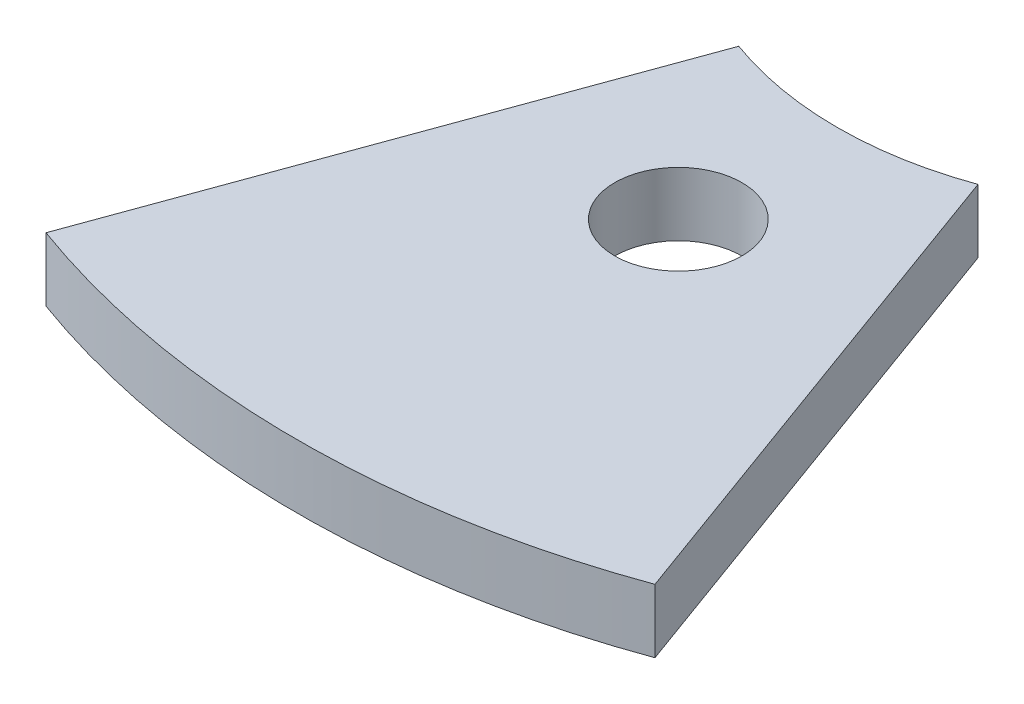
ISO-10303-21;
HEADER;
FILE_DESCRIPTION(('STEP AP214'),'2;1');
FILE_NAME('part.step','',(''),(''),'','','');
FILE_SCHEMA(('AUTOMOTIVE_DESIGN { 1 0 10303 214 1 1 1 1 }'));
ENDSEC;
DATA;
#1=APPLICATION_CONTEXT('core data for automotive mechanical design processes');
#2=APPLICATION_PROTOCOL_DEFINITION('international standard','automotive_design',2000,#1);
#3=PRODUCT_CONTEXT('',#1,'mechanical');
#4=PRODUCT('Part','Part','',(#3));
#5=PRODUCT_RELATED_PRODUCT_CATEGORY('part','',(#4));
#6=PRODUCT_DEFINITION_FORMATION('','',#4);
#7=PRODUCT_DEFINITION_CONTEXT('part definition',#1,'design');
#8=PRODUCT_DEFINITION('design','',#6,#7);
#9=PRODUCT_DEFINITION_SHAPE('','',#8);
#10=(LENGTH_UNIT() NAMED_UNIT(*) SI_UNIT(.MILLI.,.METRE.));
#11=(NAMED_UNIT(*) PLANE_ANGLE_UNIT() SI_UNIT($,.RADIAN.));
#12=(NAMED_UNIT(*) SI_UNIT($,.STERADIAN.) SOLID_ANGLE_UNIT());
#13=UNCERTAINTY_MEASURE_WITH_UNIT(LENGTH_MEASURE(1.E-05),#10,'distance_accuracy_value','');
#14=(GEOMETRIC_REPRESENTATION_CONTEXT(3) GLOBAL_UNCERTAINTY_ASSIGNED_CONTEXT((#13)) GLOBAL_UNIT_ASSIGNED_CONTEXT((#10,
#11,#12)) REPRESENTATION_CONTEXT('',''));
#15=CARTESIAN_POINT('',(0.,0.,0.));
#16=DIRECTION('',(0.,0.,1.));
#17=DIRECTION('',(1.,0.,0.));
#18=AXIS2_PLACEMENT_3D('',#15,#16,#17);
#19=CARTESIAN_POINT('',(0.,6.35,-50.8));
#20=DIRECTION('',(0.,-1.,0.));
#21=DIRECTION('',(0.,0.,-1.));
#22=AXIS2_PLACEMENT_3D('',#19,#20,#21);
#23=CYLINDRICAL_SURFACE('',#22,34.925);
#24=CARTESIAN_POINT('',(0.,0.,-50.8));
#25=DIRECTION('',(0.,1.,0.));
#26=DIRECTION('',(0.,0.,1.));
#27=AXIS2_PLACEMENT_3D('',#24,#25,#26);
#28=CIRCLE('',#27,34.925);
#29=CARTESIAN_POINT('',(-11.945053505649,0.,-17.9812352190522));
#30=VERTEX_POINT('',#29);
#31=CARTESIAN_POINT('',(11.945053505649,0.,-17.9812352190522));
#32=VERTEX_POINT('',#31);
#33=EDGE_CURVE('E119',#30,#32,#28,.T.);
#34=ORIENTED_EDGE('',*,*,#33,.F.);
#35=DIRECTION('',(0.,-1.,0.));
#36=VECTOR('',#35,1.);
#37=CARTESIAN_POINT('',(-11.945053505649,6.35,-17.9812352190522));
#38=LINE('',#37,#36);
#39=CARTESIAN_POINT('',(-11.945053505649,6.35,-17.9812352190522));
#40=VERTEX_POINT('',#39);
#41=EDGE_CURVE('E11',#40,#30,#38,.T.);
#42=ORIENTED_EDGE('',*,*,#41,.F.);
#43=CARTESIAN_POINT('',(0.,6.35,-50.8));
#44=DIRECTION('',(0.,1.,0.));
#45=DIRECTION('',(0.,0.,1.));
#46=AXIS2_PLACEMENT_3D('',#43,#44,#45);
#47=CIRCLE('',#46,34.925);
#48=CARTESIAN_POINT('',(11.945053505649,6.35,-17.9812352190522));
#49=VERTEX_POINT('',#48);
#50=EDGE_CURVE('E96',#40,#49,#47,.T.);
#51=ORIENTED_EDGE('',*,*,#50,.T.);
#52=DIRECTION('',(0.,-1.,0.));
#53=VECTOR('',#52,1.);
#54=CARTESIAN_POINT('',(11.945053505649,6.35,-17.9812352190522));
#55=LINE('',#54,#53);
#56=EDGE_CURVE('E57',#49,#32,#55,.T.);
#57=ORIENTED_EDGE('',*,*,#56,.T.);
#58=EDGE_LOOP('',(#34,#42,#51,#57));
#59=FACE_BOUND('',#58,.T.);
#60=ADVANCED_FACE('F39',(#59),#23,.F.);
#61=CARTESIAN_POINT('',(-16.3268052860381,6.35,-5.94247114477798));
#62=DIRECTION('',(0.939692620785908,0.,0.342020143325669));
#63=DIRECTION('',(0.342020143325669,0.,-0.939692620785908));
#64=AXIS2_PLACEMENT_3D('',#61,#62,#63);
#65=PLANE('',#64);
#66=DIRECTION('',(-0.342020143325669,0.,0.939692620785908));
#67=VECTOR('',#66,1.);
#68=CARTESIAN_POINT('',(-16.3268052860381,0.,-5.94247114477798));
#69=LINE('',#68,#67);
#70=CARTESIAN_POINT('',(-30.405590741652,0.,32.7386739878673));
#71=VERTEX_POINT('',#70);
#72=EDGE_CURVE('E102',#30,#71,#69,.T.);
#73=ORIENTED_EDGE('',*,*,#72,.T.);
#74=DIRECTION('',(0.,-1.,0.));
#75=VECTOR('',#74,1.);
#76=CARTESIAN_POINT('',(-30.405590741652,6.35,32.7386739878673));
#77=LINE('',#76,#75);
#78=CARTESIAN_POINT('',(-30.405590741652,6.35,32.7386739878673));
#79=VERTEX_POINT('',#78);
#80=EDGE_CURVE('E49',#79,#71,#77,.T.);
#81=ORIENTED_EDGE('',*,*,#80,.F.);
#82=DIRECTION('',(-0.342020143325669,0.,0.939692620785908));
#83=VECTOR('',#82,1.);
#84=CARTESIAN_POINT('',(-16.3268052860381,6.35,-5.94247114477798));
#85=LINE('',#84,#83);
#86=EDGE_CURVE('E92',#40,#79,#85,.T.);
#87=ORIENTED_EDGE('',*,*,#86,.F.);
#88=ORIENTED_EDGE('',*,*,#41,.T.);
#89=EDGE_LOOP('',(#73,#81,#87,#88));
#90=FACE_BOUND('',#89,.T.);
#91=ADVANCED_FACE('F100',(#90),#65,.F.);
#92=CARTESIAN_POINT('',(0.,6.35,-50.8));
#93=DIRECTION('',(0.,-1.,0.));
#94=DIRECTION('',(0.,0.,-1.));
#95=AXIS2_PLACEMENT_3D('',#92,#93,#94);
#96=CYLINDRICAL_SURFACE('',#95,88.9);
#97=CARTESIAN_POINT('',(0.,0.,-50.8));
#98=DIRECTION('',(0.,1.,0.));
#99=DIRECTION('',(0.,0.,1.));
#100=AXIS2_PLACEMENT_3D('',#97,#98,#99);
#101=CIRCLE('',#100,88.9);
#102=CARTESIAN_POINT('',(30.405590741652,0.,32.7386739878672));
#103=VERTEX_POINT('',#102);
#104=EDGE_CURVE('E114',#71,#103,#101,.T.);
#105=ORIENTED_EDGE('',*,*,#104,.T.);
#106=DIRECTION('',(0.,-1.,0.));
#107=VECTOR('',#106,1.);
#108=CARTESIAN_POINT('',(30.405590741652,6.35,32.7386739878672));
#109=LINE('',#108,#107);
#110=CARTESIAN_POINT('',(30.405590741652,6.35,32.7386739878672));
#111=VERTEX_POINT('',#110);
#112=EDGE_CURVE('E71',#111,#103,#109,.T.);
#113=ORIENTED_EDGE('',*,*,#112,.F.);
#114=CARTESIAN_POINT('',(0.,6.35,-50.8));
#115=DIRECTION('',(0.,1.,0.));
#116=DIRECTION('',(0.,0.,1.));
#117=AXIS2_PLACEMENT_3D('',#114,#115,#116);
#118=CIRCLE('',#117,88.9);
#119=EDGE_CURVE('E83',#79,#111,#118,.T.);
#120=ORIENTED_EDGE('',*,*,#119,.F.);
#121=ORIENTED_EDGE('',*,*,#80,.T.);
#122=EDGE_LOOP('',(#105,#113,#120,#121));
#123=FACE_BOUND('',#122,.T.);
#124=ADVANCED_FACE('F85',(#123),#96,.T.);
#125=CARTESIAN_POINT('',(0.,6.35,0.));
#126=DIRECTION('',(0.,-1.,0.));
#127=DIRECTION('',(0.,0.,-1.));
#128=AXIS2_PLACEMENT_3D('',#125,#126,#127);
#129=CYLINDRICAL_SURFACE('',#128,6.35);
#130=CARTESIAN_POINT('',(0.,6.35,0.));
#131=DIRECTION('',(0.,1.,0.));
#132=DIRECTION('',(0.,0.,1.));
#133=AXIS2_PLACEMENT_3D('',#130,#131,#132);
#134=CIRCLE('',#133,6.35);
#135=CARTESIAN_POINT('',(0.,6.35,6.35));
#136=VERTEX_POINT('',#135);
#137=EDGE_CURVE('E113',#136,#136,#134,.T.);
#138=ORIENTED_EDGE('',*,*,#137,.T.);
#139=EDGE_LOOP('',(#138));
#140=FACE_BOUND('',#139,.T.);
#141=CARTESIAN_POINT('',(0.,0.,0.));
#142=DIRECTION('',(0.,1.,0.));
#143=DIRECTION('',(0.,0.,1.));
#144=AXIS2_PLACEMENT_3D('',#141,#142,#143);
#145=CIRCLE('',#144,6.35);
#146=CARTESIAN_POINT('',(0.,0.,6.35));
#147=VERTEX_POINT('',#146);
#148=EDGE_CURVE('E122',#147,#147,#145,.T.);
#149=ORIENTED_EDGE('',*,*,#148,.F.);
#150=EDGE_LOOP('',(#149));
#151=FACE_BOUND('',#150,.T.);
#152=ADVANCED_FACE('F41',(#140,#151),#129,.F.);
#153=CARTESIAN_POINT('',(16.3268052860381,6.35,-5.94247114477799));
#154=DIRECTION('',(0.939692620785908,0.,-0.34202014332567));
#155=DIRECTION('',(-0.34202014332567,0.,-0.939692620785908));
#156=AXIS2_PLACEMENT_3D('',#153,#154,#155);
#157=PLANE('',#156);
#158=DIRECTION('',(0.34202014332567,0.,0.939692620785908));
#159=VECTOR('',#158,1.);
#160=CARTESIAN_POINT('',(16.3268052860381,0.,-5.94247114477799));
#161=LINE('',#160,#159);
#162=EDGE_CURVE('E109',#32,#103,#161,.T.);
#163=ORIENTED_EDGE('',*,*,#162,.F.);
#164=ORIENTED_EDGE('',*,*,#56,.F.);
#165=DIRECTION('',(0.34202014332567,0.,0.939692620785908));
#166=VECTOR('',#165,1.);
#167=CARTESIAN_POINT('',(16.3268052860381,6.35,-5.94247114477799));
#168=LINE('',#167,#166);
#169=EDGE_CURVE('E91',#49,#111,#168,.T.);
#170=ORIENTED_EDGE('',*,*,#169,.T.);
#171=ORIENTED_EDGE('',*,*,#112,.T.);
#172=EDGE_LOOP('',(#163,#164,#170,#171));
#173=FACE_BOUND('',#172,.T.);
#174=ADVANCED_FACE('F138',(#173),#157,.T.);
#175=CARTESIAN_POINT('',(0.,6.35,0.));
#176=DIRECTION('',(0.,1.,0.));
#177=DIRECTION('',(0.,0.,1.));
#178=AXIS2_PLACEMENT_3D('',#175,#176,#177);
#179=PLANE('',#178);
#180=ORIENTED_EDGE('',*,*,#137,.F.);
#181=EDGE_LOOP('',(#180));
#182=FACE_BOUND('',#181,.T.);
#183=ORIENTED_EDGE('',*,*,#50,.F.);
#184=ORIENTED_EDGE('',*,*,#86,.T.);
#185=ORIENTED_EDGE('',*,*,#119,.T.);
#186=ORIENTED_EDGE('',*,*,#169,.F.);
#187=EDGE_LOOP('',(#183,#184,#185,#186));
#188=FACE_BOUND('',#187,.T.);
#189=ADVANCED_FACE('F95',(#182,#188),#179,.T.);
#190=CARTESIAN_POINT('',(0.,0.,0.));
#191=DIRECTION('',(0.,1.,0.));
#192=DIRECTION('',(0.,0.,1.));
#193=AXIS2_PLACEMENT_3D('',#190,#191,#192);
#194=PLANE('',#193);
#195=ORIENTED_EDGE('',*,*,#148,.T.);
#196=EDGE_LOOP('',(#195));
#197=FACE_BOUND('',#196,.T.);
#198=ORIENTED_EDGE('',*,*,#33,.T.);
#199=ORIENTED_EDGE('',*,*,#162,.T.);
#200=ORIENTED_EDGE('',*,*,#104,.F.);
#201=ORIENTED_EDGE('',*,*,#72,.F.);
#202=EDGE_LOOP('',(#198,#199,#200,#201));
#203=FACE_BOUND('',#202,.T.);
#204=ADVANCED_FACE('F137',(#197,#203),#194,.F.);
#205=CLOSED_SHELL('',(#60,#91,#124,#152,#174,#189,#204));
#206=MANIFOLD_SOLID_BREP('B2',#205);
#207=ADVANCED_BREP_SHAPE_REPRESENTATION('',(#18,#206),#14);
#208=SHAPE_DEFINITION_REPRESENTATION(#9,#207);
ENDSEC;
END-ISO-10303-21;
